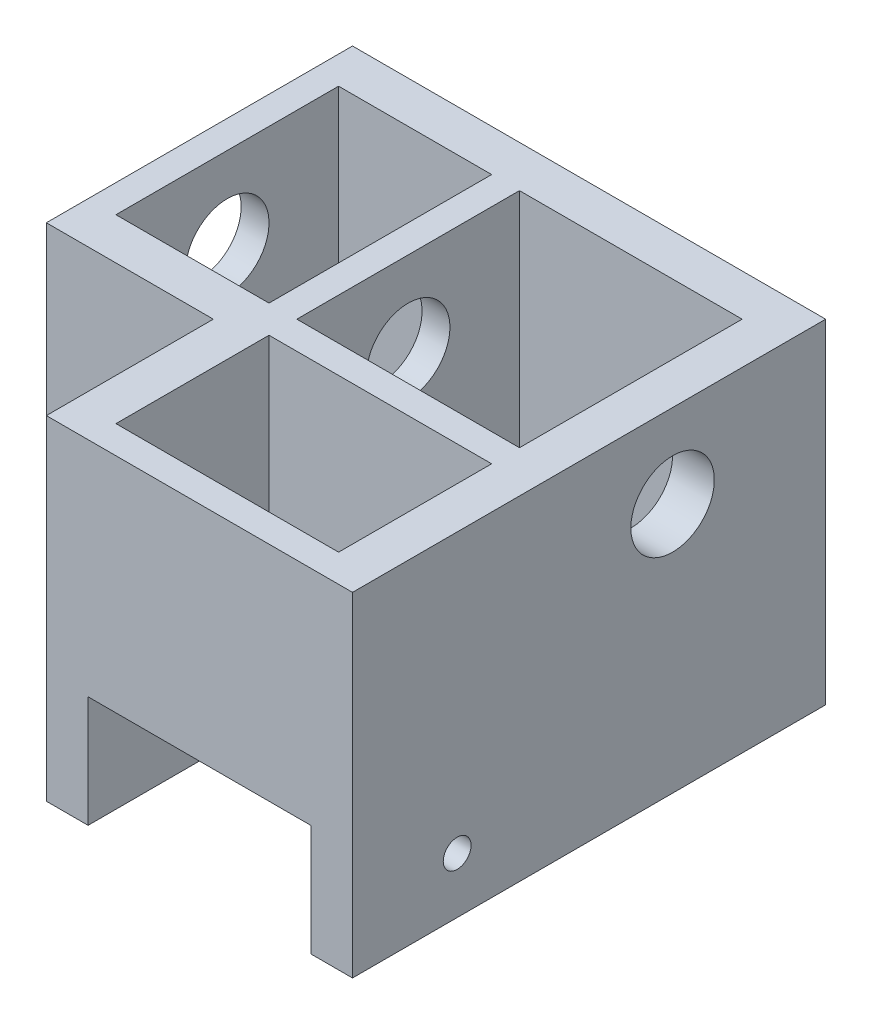
ISO-10303-21;
HEADER;
FILE_DESCRIPTION(('STEP AP214'),'2;1');
FILE_NAME('part.step','',(''),(''),'','','');
FILE_SCHEMA(('AUTOMOTIVE_DESIGN { 1 0 10303 214 1 1 1 1 }'));
ENDSEC;
DATA;
#1=APPLICATION_CONTEXT('core data for automotive mechanical design processes');
#2=APPLICATION_PROTOCOL_DEFINITION('international standard','automotive_design',2000,#1);
#3=PRODUCT_CONTEXT('',#1,'mechanical');
#4=PRODUCT('Part','Part','',(#3));
#5=PRODUCT_RELATED_PRODUCT_CATEGORY('part','',(#4));
#6=PRODUCT_DEFINITION_FORMATION('','',#4);
#7=PRODUCT_DEFINITION_CONTEXT('part definition',#1,'design');
#8=PRODUCT_DEFINITION('design','',#6,#7);
#9=PRODUCT_DEFINITION_SHAPE('','',#8);
#10=(LENGTH_UNIT() NAMED_UNIT(*) SI_UNIT(.MILLI.,.METRE.));
#11=(NAMED_UNIT(*) PLANE_ANGLE_UNIT() SI_UNIT($,.RADIAN.));
#12=(NAMED_UNIT(*) SI_UNIT($,.STERADIAN.) SOLID_ANGLE_UNIT());
#13=UNCERTAINTY_MEASURE_WITH_UNIT(LENGTH_MEASURE(1.E-05),#10,'distance_accuracy_value','');
#14=(GEOMETRIC_REPRESENTATION_CONTEXT(3) GLOBAL_UNCERTAINTY_ASSIGNED_CONTEXT((#13)) GLOBAL_UNIT_ASSIGNED_CONTEXT((#10,
#11,#12)) REPRESENTATION_CONTEXT('',''));
#15=CARTESIAN_POINT('',(0.,0.,0.));
#16=DIRECTION('',(0.,0.,1.));
#17=DIRECTION('',(1.,0.,0.));
#18=AXIS2_PLACEMENT_3D('',#15,#16,#17);
#19=CARTESIAN_POINT('',(0.,152.4,0.));
#20=DIRECTION('',(0.,1.,0.));
#21=DIRECTION('',(0.,0.,1.));
#22=AXIS2_PLACEMENT_3D('',#19,#20,#21);
#23=PLANE('',#22);
#24=DIRECTION('',(0.,0.,1.));
#25=VECTOR('',#24,1.);
#26=CARTESIAN_POINT('',(-133.35,152.4,-50.8));
#27=LINE('',#26,#25);
#28=CARTESIAN_POINT('',(-133.35,152.4,-50.8));
#29=VERTEX_POINT('',#28);
#30=CARTESIAN_POINT('',(-133.35,152.4,50.8));
#31=VERTEX_POINT('',#30);
#32=EDGE_CURVE('E299',#29,#31,#27,.T.);
#33=ORIENTED_EDGE('',*,*,#32,.F.);
#34=DIRECTION('',(-1.,0.,0.));
#35=VECTOR('',#34,1.);
#36=CARTESIAN_POINT('',(-133.35,152.4,-50.8));
#37=LINE('',#36,#35);
#38=CARTESIAN_POINT('',(-63.5,152.4,-50.8));
#39=VERTEX_POINT('',#38);
#40=EDGE_CURVE('E307',#39,#29,#37,.T.);
#41=ORIENTED_EDGE('',*,*,#40,.F.);
#42=DIRECTION('',(0.,0.,-1.));
#43=VECTOR('',#42,1.);
#44=CARTESIAN_POINT('',(-63.5,152.4,-50.8));
#45=LINE('',#44,#43);
#46=CARTESIAN_POINT('',(-63.5,152.4,50.8));
#47=VERTEX_POINT('',#46);
#48=EDGE_CURVE('E304',#47,#39,#45,.T.);
#49=ORIENTED_EDGE('',*,*,#48,.F.);
#50=DIRECTION('',(1.,0.,0.));
#51=VECTOR('',#50,1.);
#52=CARTESIAN_POINT('',(-133.35,152.4,50.8));
#53=LINE('',#52,#51);
#54=EDGE_CURVE('E301',#31,#47,#53,.T.);
#55=ORIENTED_EDGE('',*,*,#54,.F.);
#56=EDGE_LOOP('',(#33,#41,#49,#55));
#57=FACE_BOUND('',#56,.T.);
#58=DIRECTION('',(0.,0.,-1.));
#59=VECTOR('',#58,1.);
#60=CARTESIAN_POINT('',(69.85,152.4,0.));
#61=LINE('',#60,#59);
#62=CARTESIAN_POINT('',(69.8500000000001,152.4,146.05));
#63=VERTEX_POINT('',#62);
#64=CARTESIAN_POINT('',(69.85,152.4,-69.85));
#65=VERTEX_POINT('',#64);
#66=EDGE_CURVE('E382',#63,#65,#61,.T.);
#67=ORIENTED_EDGE('',*,*,#66,.T.);
#68=DIRECTION('',(-1.,0.,0.));
#69=VECTOR('',#68,1.);
#70=CARTESIAN_POINT('',(0.,152.4,-69.85));
#71=LINE('',#70,#69);
#72=CARTESIAN_POINT('',(-146.05,152.4,-69.85));
#73=VERTEX_POINT('',#72);
#74=EDGE_CURVE('E385',#65,#73,#71,.T.);
#75=ORIENTED_EDGE('',*,*,#74,.T.);
#76=DIRECTION('',(0.,0.,-1.));
#77=VECTOR('',#76,1.);
#78=CARTESIAN_POINT('',(-146.05,152.4,69.85));
#79=LINE('',#78,#77);
#80=CARTESIAN_POINT('',(-146.05,152.4,69.85));
#81=VERTEX_POINT('',#80);
#82=EDGE_CURVE('E334',#81,#73,#79,.T.);
#83=ORIENTED_EDGE('',*,*,#82,.F.);
#84=DIRECTION('',(1.,0.,0.));
#85=VECTOR('',#84,1.);
#86=CARTESIAN_POINT('',(0.,152.4,69.85));
#87=LINE('',#86,#85);
#88=CARTESIAN_POINT('',(-69.85,152.4,69.85));
#89=VERTEX_POINT('',#88);
#90=EDGE_CURVE('E388',#81,#89,#87,.T.);
#91=ORIENTED_EDGE('',*,*,#90,.T.);
#92=DIRECTION('',(0.,0.,-1.));
#93=VECTOR('',#92,1.);
#94=CARTESIAN_POINT('',(-69.8499999999999,152.4,146.05));
#95=LINE('',#94,#93);
#96=CARTESIAN_POINT('',(-69.8499999999999,152.4,146.05));
#97=VERTEX_POINT('',#96);
#98=EDGE_CURVE('E272',#97,#89,#95,.T.);
#99=ORIENTED_EDGE('',*,*,#98,.F.);
#100=DIRECTION('',(1.,0.,0.));
#101=VECTOR('',#100,1.);
#102=CARTESIAN_POINT('',(-69.8499999999999,152.4,146.05));
#103=LINE('',#102,#101);
#104=EDGE_CURVE('E253',#97,#63,#103,.T.);
#105=ORIENTED_EDGE('',*,*,#104,.T.);
#106=EDGE_LOOP('',(#67,#75,#83,#91,#99,#105));
#107=FACE_BOUND('',#106,.T.);
#108=DIRECTION('',(-1.,0.,0.));
#109=VECTOR('',#108,1.);
#110=CARTESIAN_POINT('',(-50.8,152.4,-50.8));
#111=LINE('',#110,#109);
#112=CARTESIAN_POINT('',(50.8,152.4,-50.8));
#113=VERTEX_POINT('',#112);
#114=CARTESIAN_POINT('',(-50.8,152.4,-50.8));
#115=VERTEX_POINT('',#114);
#116=EDGE_CURVE('E357',#113,#115,#111,.T.);
#117=ORIENTED_EDGE('',*,*,#116,.F.);
#118=DIRECTION('',(0.,0.,-1.));
#119=VECTOR('',#118,1.);
#120=CARTESIAN_POINT('',(50.8,152.4,50.8));
#121=LINE('',#120,#119);
#122=CARTESIAN_POINT('',(50.8,152.4,50.8));
#123=VERTEX_POINT('',#122);
#124=EDGE_CURVE('E355',#123,#113,#121,.T.);
#125=ORIENTED_EDGE('',*,*,#124,.F.);
#126=DIRECTION('',(1.,0.,0.));
#127=VECTOR('',#126,1.);
#128=CARTESIAN_POINT('',(-50.8,152.4,50.8));
#129=LINE('',#128,#127);
#130=CARTESIAN_POINT('',(-50.8,152.4,50.8));
#131=VERTEX_POINT('',#130);
#132=EDGE_CURVE('E363',#131,#123,#129,.T.);
#133=ORIENTED_EDGE('',*,*,#132,.F.);
#134=DIRECTION('',(0.,0.,1.));
#135=VECTOR('',#134,1.);
#136=CARTESIAN_POINT('',(-50.8,152.4,50.8));
#137=LINE('',#136,#135);
#138=EDGE_CURVE('E360',#115,#131,#137,.T.);
#139=ORIENTED_EDGE('',*,*,#138,.F.);
#140=EDGE_LOOP('',(#117,#125,#133,#139));
#141=FACE_BOUND('',#140,.T.);
#142=DIRECTION('',(0.,0.,1.));
#143=VECTOR('',#142,1.);
#144=CARTESIAN_POINT('',(50.8000000000001,152.4,133.35));
#145=LINE('',#144,#143);
#146=CARTESIAN_POINT('',(50.8,152.4,63.5));
#147=VERTEX_POINT('',#146);
#148=CARTESIAN_POINT('',(50.8000000000001,152.4,133.35));
#149=VERTEX_POINT('',#148);
#150=EDGE_CURVE('E227',#147,#149,#145,.T.);
#151=ORIENTED_EDGE('',*,*,#150,.T.);
#152=DIRECTION('',(-1.,0.,0.));
#153=VECTOR('',#152,1.);
#154=CARTESIAN_POINT('',(50.8000000000001,152.4,133.35));
#155=LINE('',#154,#153);
#156=CARTESIAN_POINT('',(-50.7999999999999,152.4,133.35));
#157=VERTEX_POINT('',#156);
#158=EDGE_CURVE('E82',#149,#157,#155,.T.);
#159=ORIENTED_EDGE('',*,*,#158,.T.);
#160=DIRECTION('',(0.,0.,-1.));
#161=VECTOR('',#160,1.);
#162=CARTESIAN_POINT('',(-50.7999999999999,152.4,133.35));
#163=LINE('',#162,#161);
#164=CARTESIAN_POINT('',(-50.8,152.4,63.5));
#165=VERTEX_POINT('',#164);
#166=EDGE_CURVE('E234',#157,#165,#163,.T.);
#167=ORIENTED_EDGE('',*,*,#166,.T.);
#168=DIRECTION('',(1.,0.,0.));
#169=VECTOR('',#168,1.);
#170=CARTESIAN_POINT('',(50.8,152.4,63.5));
#171=LINE('',#170,#169);
#172=EDGE_CURVE('E219',#165,#147,#171,.T.);
#173=ORIENTED_EDGE('',*,*,#172,.T.);
#174=EDGE_LOOP('',(#151,#159,#167,#173));
#175=FACE_BOUND('',#174,.T.);
#176=ADVANCED_FACE('F66',(#57,#107,#141,#175),#23,.T.);
#177=CARTESIAN_POINT('',(0.,50.8,0.));
#178=DIRECTION('',(0.,1.,0.));
#179=DIRECTION('',(0.,0.,1.));
#180=AXIS2_PLACEMENT_3D('',#177,#178,#179);
#181=PLANE('',#180);
#182=DIRECTION('',(-1.,0.,0.));
#183=VECTOR('',#182,1.);
#184=CARTESIAN_POINT('',(0.,50.8,133.35));
#185=LINE('',#184,#183);
#186=CARTESIAN_POINT('',(50.8000000000001,50.8,133.35));
#187=VERTEX_POINT('',#186);
#188=CARTESIAN_POINT('',(-50.7999999999999,50.8,133.35));
#189=VERTEX_POINT('',#188);
#190=EDGE_CURVE('E12',#187,#189,#185,.T.);
#191=ORIENTED_EDGE('',*,*,#190,.F.);
#192=DIRECTION('',(0.,0.,-1.));
#193=VECTOR('',#192,1.);
#194=CARTESIAN_POINT('',(50.8,50.8,50.8));
#195=LINE('',#194,#193);
#196=CARTESIAN_POINT('',(50.8000000000001,50.8,146.05));
#197=VERTEX_POINT('',#196);
#198=EDGE_CURVE('E286',#197,#187,#195,.T.);
#199=ORIENTED_EDGE('',*,*,#198,.F.);
#200=DIRECTION('',(-1.,0.,0.));
#201=VECTOR('',#200,1.);
#202=CARTESIAN_POINT('',(50.8000000000001,50.8,146.05));
#203=LINE('',#202,#201);
#204=CARTESIAN_POINT('',(-50.7999999999999,50.8,146.05));
#205=VERTEX_POINT('',#204);
#206=EDGE_CURVE('E265',#197,#205,#203,.T.);
#207=ORIENTED_EDGE('',*,*,#206,.T.);
#208=DIRECTION('',(0.,0.,1.));
#209=VECTOR('',#208,1.);
#210=CARTESIAN_POINT('',(-50.8,50.8,50.8));
#211=LINE('',#210,#209);
#212=EDGE_CURVE('E282',#189,#205,#211,.T.);
#213=ORIENTED_EDGE('',*,*,#212,.F.);
#214=EDGE_LOOP('',(#191,#199,#207,#213));
#215=FACE_BOUND('',#214,.T.);
#216=ADVANCED_FACE('F478',(#215),#181,.F.);
#217=DIRECTION('',(1.,0.,0.));
#218=VECTOR('',#217,1.);
#219=CARTESIAN_POINT('',(0.,50.8,63.5));
#220=LINE('',#219,#218);
#221=CARTESIAN_POINT('',(-50.8,50.8,63.5));
#222=VERTEX_POINT('',#221);
#223=CARTESIAN_POINT('',(50.8,50.8,63.5));
#224=VERTEX_POINT('',#223);
#225=EDGE_CURVE('E75',#222,#224,#220,.T.);
#226=ORIENTED_EDGE('',*,*,#225,.F.);
#227=CARTESIAN_POINT('',(-50.8,50.8,50.8));
#228=VERTEX_POINT('',#227);
#229=EDGE_CURVE('E278',#228,#222,#211,.T.);
#230=ORIENTED_EDGE('',*,*,#229,.F.);
#231=DIRECTION('',(-1.,0.,0.));
#232=VECTOR('',#231,1.);
#233=CARTESIAN_POINT('',(-50.8,50.8,50.8));
#234=LINE('',#233,#232);
#235=CARTESIAN_POINT('',(50.8,50.8,50.8));
#236=VERTEX_POINT('',#235);
#237=EDGE_CURVE('E283',#236,#228,#234,.T.);
#238=ORIENTED_EDGE('',*,*,#237,.F.);
#239=EDGE_CURVE('E277',#224,#236,#195,.T.);
#240=ORIENTED_EDGE('',*,*,#239,.F.);
#241=EDGE_LOOP('',(#226,#230,#238,#240));
#242=FACE_BOUND('',#241,.T.);
#243=ADVANCED_FACE('F538',(#242),#181,.F.);
#244=CARTESIAN_POINT('',(0.,0.,0.));
#245=DIRECTION('',(0.,1.,0.));
#246=DIRECTION('',(0.,0.,1.));
#247=AXIS2_PLACEMENT_3D('',#244,#245,#246);
#248=PLANE('',#247);
#249=DIRECTION('',(0.,0.,1.));
#250=VECTOR('',#249,1.);
#251=CARTESIAN_POINT('',(-50.8,0.,50.8));
#252=LINE('',#251,#250);
#253=CARTESIAN_POINT('',(-50.8,0.,50.8));
#254=VERTEX_POINT('',#253);
#255=CARTESIAN_POINT('',(-50.7999999999999,0.,146.05));
#256=VERTEX_POINT('',#255);
#257=EDGE_CURVE('E275',#254,#256,#252,.T.);
#258=ORIENTED_EDGE('',*,*,#257,.T.);
#259=DIRECTION('',(-1.,0.,0.));
#260=VECTOR('',#259,1.);
#261=CARTESIAN_POINT('',(-50.7999999999999,0.,146.05));
#262=LINE('',#261,#260);
#263=CARTESIAN_POINT('',(-69.8499999999999,0.,146.05));
#264=VERTEX_POINT('',#263);
#265=EDGE_CURVE('E259',#256,#264,#262,.T.);
#266=ORIENTED_EDGE('',*,*,#265,.T.);
#267=DIRECTION('',(0.,0.,-1.));
#268=VECTOR('',#267,1.);
#269=CARTESIAN_POINT('',(-69.8499999999999,0.,146.05));
#270=LINE('',#269,#268);
#271=CARTESIAN_POINT('',(-69.85,0.,69.85));
#272=VERTEX_POINT('',#271);
#273=EDGE_CURVE('E268',#264,#272,#270,.T.);
#274=ORIENTED_EDGE('',*,*,#273,.T.);
#275=DIRECTION('',(1.,0.,0.));
#276=VECTOR('',#275,1.);
#277=CARTESIAN_POINT('',(0.,0.,69.85));
#278=LINE('',#277,#276);
#279=CARTESIAN_POINT('',(-146.05,0.,69.85));
#280=VERTEX_POINT('',#279);
#281=EDGE_CURVE('E386',#280,#272,#278,.T.);
#282=ORIENTED_EDGE('',*,*,#281,.F.);
#283=DIRECTION('',(0.,0.,1.));
#284=VECTOR('',#283,1.);
#285=CARTESIAN_POINT('',(-146.05,0.,50.8));
#286=LINE('',#285,#284);
#287=CARTESIAN_POINT('',(-146.05,0.,50.8));
#288=VERTEX_POINT('',#287);
#289=EDGE_CURVE('E328',#288,#280,#286,.T.);
#290=ORIENTED_EDGE('',*,*,#289,.F.);
#291=DIRECTION('',(1.,0.,0.));
#292=VECTOR('',#291,1.);
#293=CARTESIAN_POINT('',(-50.8,0.,50.8));
#294=LINE('',#293,#292);
#295=EDGE_CURVE('E358',#288,#254,#294,.T.);
#296=ORIENTED_EDGE('',*,*,#295,.T.);
#297=EDGE_LOOP('',(#258,#266,#274,#282,#290,#296));
#298=FACE_BOUND('',#297,.T.);
#299=ADVANCED_FACE('F469',(#298),#248,.F.);
#300=DIRECTION('',(0.,0.,-1.));
#301=VECTOR('',#300,1.);
#302=CARTESIAN_POINT('',(69.85,0.,0.));
#303=LINE('',#302,#301);
#304=CARTESIAN_POINT('',(69.8500000000001,0.,146.05));
#305=VERTEX_POINT('',#304);
#306=CARTESIAN_POINT('',(69.85,0.,-69.85));
#307=VERTEX_POINT('',#306);
#308=EDGE_CURVE('E381',#305,#307,#303,.T.);
#309=ORIENTED_EDGE('',*,*,#308,.F.);
#310=DIRECTION('',(-1.,0.,0.));
#311=VECTOR('',#310,1.);
#312=CARTESIAN_POINT('',(69.8500000000001,0.,146.05));
#313=LINE('',#312,#311);
#314=CARTESIAN_POINT('',(50.8000000000001,0.,146.05));
#315=VERTEX_POINT('',#314);
#316=EDGE_CURVE('E247',#305,#315,#313,.T.);
#317=ORIENTED_EDGE('',*,*,#316,.T.);
#318=DIRECTION('',(0.,0.,-1.));
#319=VECTOR('',#318,1.);
#320=CARTESIAN_POINT('',(50.8,0.,50.8));
#321=LINE('',#320,#319);
#322=CARTESIAN_POINT('',(50.8,0.,-50.8));
#323=VERTEX_POINT('',#322);
#324=EDGE_CURVE('E351',#315,#323,#321,.T.);
#325=ORIENTED_EDGE('',*,*,#324,.T.);
#326=DIRECTION('',(-1.,0.,0.));
#327=VECTOR('',#326,1.);
#328=CARTESIAN_POINT('',(-50.8,0.,-50.8));
#329=LINE('',#328,#327);
#330=CARTESIAN_POINT('',(-146.05,0.,-50.8));
#331=VERTEX_POINT('',#330);
#332=EDGE_CURVE('E367',#323,#331,#329,.T.);
#333=ORIENTED_EDGE('',*,*,#332,.T.);
#334=DIRECTION('',(0.,0.,1.));
#335=VECTOR('',#334,1.);
#336=CARTESIAN_POINT('',(-146.05,0.,-69.85));
#337=LINE('',#336,#335);
#338=CARTESIAN_POINT('',(-146.05,0.,-69.85));
#339=VERTEX_POINT('',#338);
#340=EDGE_CURVE('E340',#339,#331,#337,.T.);
#341=ORIENTED_EDGE('',*,*,#340,.F.);
#342=DIRECTION('',(-1.,0.,0.));
#343=VECTOR('',#342,1.);
#344=CARTESIAN_POINT('',(0.,0.,-69.85));
#345=LINE('',#344,#343);
#346=EDGE_CURVE('E394',#307,#339,#345,.T.);
#347=ORIENTED_EDGE('',*,*,#346,.F.);
#348=EDGE_LOOP('',(#309,#317,#325,#333,#341,#347));
#349=FACE_BOUND('',#348,.T.);
#350=ADVANCED_FACE('F446',(#349),#248,.F.);
#351=CARTESIAN_POINT('',(0.,152.4,69.85));
#352=DIRECTION('',(0.,0.,-1.));
#353=DIRECTION('',(-1.,0.,0.));
#354=AXIS2_PLACEMENT_3D('',#351,#352,#353);
#355=PLANE('',#354);
#356=CARTESIAN_POINT('',(-98.298,25.4,69.85));
#357=DIRECTION('',(0.,0.,1.));
#358=DIRECTION('',(1.,0.,0.));
#359=AXIS2_PLACEMENT_3D('',#356,#357,#358);
#360=CIRCLE('',#359,6.35);
#361=CARTESIAN_POINT('',(-91.948,25.4,69.85));
#362=VERTEX_POINT('',#361);
#363=EDGE_CURVE('E281',#362,#362,#360,.T.);
#364=ORIENTED_EDGE('',*,*,#363,.F.);
#365=EDGE_LOOP('',(#364));
#366=FACE_BOUND('',#365,.T.);
#367=ORIENTED_EDGE('',*,*,#281,.T.);
#368=DIRECTION('',(0.,1.,0.));
#369=VECTOR('',#368,1.);
#370=CARTESIAN_POINT('',(-69.85,0.,69.85));
#371=LINE('',#370,#369);
#372=EDGE_CURVE('E241',#272,#89,#371,.T.);
#373=ORIENTED_EDGE('',*,*,#372,.T.);
#374=ORIENTED_EDGE('',*,*,#90,.F.);
#375=DIRECTION('',(0.,1.,0.));
#376=VECTOR('',#375,1.);
#377=CARTESIAN_POINT('',(-146.05,0.,69.85));
#378=LINE('',#377,#376);
#379=EDGE_CURVE('E331',#280,#81,#378,.T.);
#380=ORIENTED_EDGE('',*,*,#379,.F.);
#381=EDGE_LOOP('',(#367,#373,#374,#380));
#382=FACE_BOUND('',#381,.T.);
#383=ADVANCED_FACE('F417',(#366,#382),#355,.F.);
#384=CARTESIAN_POINT('',(-50.8,152.4,50.8));
#385=DIRECTION('',(0.,0.,-1.));
#386=DIRECTION('',(-1.,0.,0.));
#387=AXIS2_PLACEMENT_3D('',#384,#385,#386);
#388=PLANE('',#387);
#389=CARTESIAN_POINT('',(-98.298,25.4,50.8));
#390=DIRECTION('',(0.,0.,-1.));
#391=DIRECTION('',(-1.,0.,0.));
#392=AXIS2_PLACEMENT_3D('',#389,#390,#391);
#393=CIRCLE('',#392,6.35);
#394=CARTESIAN_POINT('',(-104.648,25.4,50.8));
#395=VERTEX_POINT('',#394);
#396=EDGE_CURVE('E293',#395,#395,#393,.T.);
#397=ORIENTED_EDGE('',*,*,#396,.F.);
#398=EDGE_LOOP('',(#397));
#399=FACE_BOUND('',#398,.T.);
#400=DIRECTION('',(-1.,0.,0.));
#401=VECTOR('',#400,1.);
#402=CARTESIAN_POINT('',(-50.8,50.8,50.8));
#403=LINE('',#402,#401);
#404=CARTESIAN_POINT('',(-63.5,50.8,50.8));
#405=VERTEX_POINT('',#404);
#406=EDGE_CURVE('E344',#228,#405,#403,.T.);
#407=ORIENTED_EDGE('',*,*,#406,.F.);
#408=DIRECTION('',(0.,-1.,0.));
#409=VECTOR('',#408,1.);
#410=CARTESIAN_POINT('',(-50.8,154.170510785233,50.8));
#411=LINE('',#410,#409);
#412=EDGE_CURVE('E274',#228,#254,#411,.T.);
#413=ORIENTED_EDGE('',*,*,#412,.T.);
#414=ORIENTED_EDGE('',*,*,#295,.F.);
#415=DIRECTION('',(0.,-1.,0.));
#416=VECTOR('',#415,1.);
#417=CARTESIAN_POINT('',(-146.05,50.8,50.8));
#418=LINE('',#417,#416);
#419=CARTESIAN_POINT('',(-146.05,50.8,50.8));
#420=VERTEX_POINT('',#419);
#421=EDGE_CURVE('E325',#420,#288,#418,.T.);
#422=ORIENTED_EDGE('',*,*,#421,.F.);
#423=CARTESIAN_POINT('',(-133.35,50.8,50.8));
#424=VERTEX_POINT('',#423);
#425=EDGE_CURVE('E343',#424,#420,#403,.T.);
#426=ORIENTED_EDGE('',*,*,#425,.F.);
#427=DIRECTION('',(0.,1.,0.));
#428=VECTOR('',#427,1.);
#429=CARTESIAN_POINT('',(-133.35,0.,50.8));
#430=LINE('',#429,#428);
#431=EDGE_CURVE('E310',#424,#31,#430,.T.);
#432=ORIENTED_EDGE('',*,*,#431,.T.);
#433=ORIENTED_EDGE('',*,*,#54,.T.);
#434=DIRECTION('',(0.,1.,0.));
#435=VECTOR('',#434,1.);
#436=CARTESIAN_POINT('',(-63.5,0.,50.8));
#437=LINE('',#436,#435);
#438=EDGE_CURVE('E316',#405,#47,#437,.T.);
#439=ORIENTED_EDGE('',*,*,#438,.F.);
#440=EDGE_LOOP('',(#407,#413,#414,#422,#426,#432,#433,#439));
#441=FACE_BOUND('',#440,.T.);
#442=ADVANCED_FACE('F413',(#399,#441),#388,.T.);
#443=CARTESIAN_POINT('',(0.,50.8,0.));
#444=DIRECTION('',(0.,1.,0.));
#445=DIRECTION('',(0.,0.,1.));
#446=AXIS2_PLACEMENT_3D('',#443,#444,#445);
#447=PLANE('',#446);
#448=DIRECTION('',(1.,0.,0.));
#449=VECTOR('',#448,1.);
#450=CARTESIAN_POINT('',(-50.8,50.8,-50.8));
#451=LINE('',#450,#449);
#452=CARTESIAN_POINT('',(-146.05,50.8,-50.8));
#453=VERTEX_POINT('',#452);
#454=CARTESIAN_POINT('',(-133.35,50.8,-50.8));
#455=VERTEX_POINT('',#454);
#456=EDGE_CURVE('E352',#453,#455,#451,.T.);
#457=ORIENTED_EDGE('',*,*,#456,.T.);
#458=DIRECTION('',(0.,0.,1.));
#459=VECTOR('',#458,1.);
#460=CARTESIAN_POINT('',(-133.35,50.8,0.));
#461=LINE('',#460,#459);
#462=EDGE_CURVE('E403',#455,#424,#461,.T.);
#463=ORIENTED_EDGE('',*,*,#462,.T.);
#464=ORIENTED_EDGE('',*,*,#425,.T.);
#465=DIRECTION('',(0.,0.,1.));
#466=VECTOR('',#465,1.);
#467=CARTESIAN_POINT('',(-146.05,50.8,-50.8));
#468=LINE('',#467,#466);
#469=EDGE_CURVE('E322',#453,#420,#468,.T.);
#470=ORIENTED_EDGE('',*,*,#469,.F.);
#471=EDGE_LOOP('',(#457,#463,#464,#470));
#472=FACE_BOUND('',#471,.T.);
#473=ADVANCED_FACE('F416',(#472),#447,.F.);
#474=CARTESIAN_POINT('',(69.85,152.4,0.));
#475=DIRECTION('',(-1.,0.,0.));
#476=DIRECTION('',(0.,0.,1.));
#477=AXIS2_PLACEMENT_3D('',#474,#475,#476);
#478=PLANE('',#477);
#479=CARTESIAN_POINT('',(69.8500000000001,114.3,0.));
#480=DIRECTION('',(-1.,0.,0.));
#481=DIRECTION('',(0.,0.,1.));
#482=AXIS2_PLACEMENT_3D('',#479,#480,#481);
#483=CIRCLE('',#482,19.05);
#484=CARTESIAN_POINT('',(69.8500000000001,114.3,19.05));
#485=VERTEX_POINT('',#484);
#486=EDGE_CURVE('E505',#485,#485,#483,.T.);
#487=ORIENTED_EDGE('',*,*,#486,.T.);
#488=EDGE_LOOP('',(#487));
#489=FACE_BOUND('',#488,.T.);
#490=CARTESIAN_POINT('',(69.8500000000001,25.4,98.298));
#491=DIRECTION('',(1.,0.,0.));
#492=DIRECTION('',(0.,0.,-1.));
#493=AXIS2_PLACEMENT_3D('',#490,#491,#492);
#494=CIRCLE('',#493,6.35);
#495=CARTESIAN_POINT('',(69.8500000000001,25.4,91.948));
#496=VERTEX_POINT('',#495);
#497=EDGE_CURVE('E487',#496,#496,#494,.T.);
#498=ORIENTED_EDGE('',*,*,#497,.F.);
#499=EDGE_LOOP('',(#498));
#500=FACE_BOUND('',#499,.T.);
#501=ORIENTED_EDGE('',*,*,#308,.T.);
#502=DIRECTION('',(0.,-1.,0.));
#503=VECTOR('',#502,1.);
#504=CARTESIAN_POINT('',(69.85,152.4,-69.85));
#505=LINE('',#504,#503);
#506=EDGE_CURVE('E391',#65,#307,#505,.T.);
#507=ORIENTED_EDGE('',*,*,#506,.F.);
#508=ORIENTED_EDGE('',*,*,#66,.F.);
#509=DIRECTION('',(0.,-1.,0.));
#510=VECTOR('',#509,1.);
#511=CARTESIAN_POINT('',(69.8500000000001,152.4,146.05));
#512=LINE('',#511,#510);
#513=EDGE_CURVE('E250',#63,#305,#512,.T.);
#514=ORIENTED_EDGE('',*,*,#513,.T.);
#515=EDGE_LOOP('',(#501,#507,#508,#514));
#516=FACE_BOUND('',#515,.T.);
#517=ADVANCED_FACE('F68',(#489,#500,#516),#478,.F.);
#518=CARTESIAN_POINT('',(0.,152.4,-69.85));
#519=DIRECTION('',(0.,0.,1.));
#520=DIRECTION('',(1.,0.,0.));
#521=AXIS2_PLACEMENT_3D('',#518,#519,#520);
#522=PLANE('',#521);
#523=CARTESIAN_POINT('',(-98.298,25.4,-69.85));
#524=DIRECTION('',(0.,0.,1.));
#525=DIRECTION('',(1.,0.,0.));
#526=AXIS2_PLACEMENT_3D('',#523,#524,#525);
#527=CIRCLE('',#526,6.35);
#528=CARTESIAN_POINT('',(-91.948,25.4,-69.85));
#529=VERTEX_POINT('',#528);
#530=EDGE_CURVE('E290',#529,#529,#527,.T.);
#531=ORIENTED_EDGE('',*,*,#530,.T.);
#532=EDGE_LOOP('',(#531));
#533=FACE_BOUND('',#532,.T.);
#534=ORIENTED_EDGE('',*,*,#346,.T.);
#535=DIRECTION('',(0.,-1.,0.));
#536=VECTOR('',#535,1.);
#537=CARTESIAN_POINT('',(-146.05,152.4,-69.85));
#538=LINE('',#537,#536);
#539=EDGE_CURVE('E337',#73,#339,#538,.T.);
#540=ORIENTED_EDGE('',*,*,#539,.F.);
#541=ORIENTED_EDGE('',*,*,#74,.F.);
#542=ORIENTED_EDGE('',*,*,#506,.T.);
#543=EDGE_LOOP('',(#534,#540,#541,#542));
#544=FACE_BOUND('',#543,.T.);
#545=ADVANCED_FACE('F452',(#533,#544),#522,.F.);
#546=CARTESIAN_POINT('',(50.8,152.4,50.8));
#547=DIRECTION('',(-1.,0.,0.));
#548=DIRECTION('',(0.,0.,1.));
#549=AXIS2_PLACEMENT_3D('',#546,#547,#548);
#550=PLANE('',#549);
#551=CARTESIAN_POINT('',(50.8,114.3,0.));
#552=DIRECTION('',(-1.,0.,0.));
#553=DIRECTION('',(0.,0.,1.));
#554=AXIS2_PLACEMENT_3D('',#551,#552,#553);
#555=CIRCLE('',#554,19.05);
#556=CARTESIAN_POINT('',(50.8,114.3,19.05));
#557=VERTEX_POINT('',#556);
#558=EDGE_CURVE('E491',#557,#557,#555,.T.);
#559=ORIENTED_EDGE('',*,*,#558,.F.);
#560=EDGE_LOOP('',(#559));
#561=FACE_BOUND('',#560,.T.);
#562=CARTESIAN_POINT('',(50.8,25.4,98.298));
#563=DIRECTION('',(-1.,0.,0.));
#564=DIRECTION('',(0.,0.,1.));
#565=AXIS2_PLACEMENT_3D('',#562,#563,#564);
#566=CIRCLE('',#565,6.35);
#567=CARTESIAN_POINT('',(50.8,25.4,104.648));
#568=VERTEX_POINT('',#567);
#569=EDGE_CURVE('E480',#568,#568,#566,.F.);
#570=ORIENTED_EDGE('',*,*,#569,.T.);
#571=EDGE_LOOP('',(#570));
#572=FACE_BOUND('',#571,.T.);
#573=DIRECTION('',(0.,-1.,0.));
#574=VECTOR('',#573,1.);
#575=CARTESIAN_POINT('',(50.8,152.4,-50.8));
#576=LINE('',#575,#574);
#577=EDGE_CURVE('E379',#113,#323,#576,.T.);
#578=ORIENTED_EDGE('',*,*,#577,.T.);
#579=ORIENTED_EDGE('',*,*,#324,.F.);
#580=DIRECTION('',(0.,1.,0.));
#581=VECTOR('',#580,1.);
#582=CARTESIAN_POINT('',(50.8000000000001,0.,146.05));
#583=LINE('',#582,#581);
#584=EDGE_CURVE('E244',#315,#197,#583,.T.);
#585=ORIENTED_EDGE('',*,*,#584,.T.);
#586=ORIENTED_EDGE('',*,*,#198,.T.);
#587=DIRECTION('',(0.,1.,0.));
#588=VECTOR('',#587,1.);
#589=CARTESIAN_POINT('',(50.8000000000001,0.,133.35));
#590=LINE('',#589,#588);
#591=EDGE_CURVE('E224',#187,#149,#590,.T.);
#592=ORIENTED_EDGE('',*,*,#591,.T.);
#593=ORIENTED_EDGE('',*,*,#150,.F.);
#594=DIRECTION('',(0.,1.,0.));
#595=VECTOR('',#594,1.);
#596=CARTESIAN_POINT('',(50.8,0.,63.5));
#597=LINE('',#596,#595);
#598=EDGE_CURVE('E90',#224,#147,#597,.T.);
#599=ORIENTED_EDGE('',*,*,#598,.F.);
#600=ORIENTED_EDGE('',*,*,#239,.T.);
#601=DIRECTION('',(0.,-1.,0.));
#602=VECTOR('',#601,1.);
#603=CARTESIAN_POINT('',(50.8,152.4,50.8));
#604=LINE('',#603,#602);
#605=EDGE_CURVE('E365',#123,#236,#604,.T.);
#606=ORIENTED_EDGE('',*,*,#605,.F.);
#607=ORIENTED_EDGE('',*,*,#124,.T.);
#608=EDGE_LOOP('',(#578,#579,#585,#586,#592,#593,#599,#600,#606,#607));
#609=FACE_BOUND('',#608,.T.);
#610=ADVANCED_FACE('F229',(#561,#572,#609),#550,.T.);
#611=CARTESIAN_POINT('',(-50.8,152.4,-50.8));
#612=DIRECTION('',(0.,0.,1.));
#613=DIRECTION('',(1.,0.,0.));
#614=AXIS2_PLACEMENT_3D('',#611,#612,#613);
#615=PLANE('',#614);
#616=CARTESIAN_POINT('',(-98.298,25.4,-50.8));
#617=DIRECTION('',(0.,0.,1.));
#618=DIRECTION('',(1.,0.,0.));
#619=AXIS2_PLACEMENT_3D('',#616,#617,#618);
#620=CIRCLE('',#619,6.35);
#621=CARTESIAN_POINT('',(-91.948,25.4,-50.8));
#622=VERTEX_POINT('',#621);
#623=EDGE_CURVE('E296',#622,#622,#620,.T.);
#624=ORIENTED_EDGE('',*,*,#623,.F.);
#625=EDGE_LOOP('',(#624));
#626=FACE_BOUND('',#625,.T.);
#627=CARTESIAN_POINT('',(-63.5,50.8,-50.8));
#628=VERTEX_POINT('',#627);
#629=CARTESIAN_POINT('',(-50.8,50.8,-50.8));
#630=VERTEX_POINT('',#629);
#631=EDGE_CURVE('E347',#628,#630,#451,.T.);
#632=ORIENTED_EDGE('',*,*,#631,.F.);
#633=DIRECTION('',(0.,1.,0.));
#634=VECTOR('',#633,1.);
#635=CARTESIAN_POINT('',(-63.5,0.,-50.8));
#636=LINE('',#635,#634);
#637=EDGE_CURVE('E314',#628,#39,#636,.T.);
#638=ORIENTED_EDGE('',*,*,#637,.T.);
#639=ORIENTED_EDGE('',*,*,#40,.T.);
#640=DIRECTION('',(0.,1.,0.));
#641=VECTOR('',#640,1.);
#642=CARTESIAN_POINT('',(-133.35,0.,-50.8));
#643=LINE('',#642,#641);
#644=EDGE_CURVE('E311',#455,#29,#643,.T.);
#645=ORIENTED_EDGE('',*,*,#644,.F.);
#646=ORIENTED_EDGE('',*,*,#456,.F.);
#647=DIRECTION('',(0.,1.,0.));
#648=VECTOR('',#647,1.);
#649=CARTESIAN_POINT('',(-146.05,0.,-50.8));
#650=LINE('',#649,#648);
#651=EDGE_CURVE('E313',#331,#453,#650,.T.);
#652=ORIENTED_EDGE('',*,*,#651,.F.);
#653=ORIENTED_EDGE('',*,*,#332,.F.);
#654=ORIENTED_EDGE('',*,*,#577,.F.);
#655=ORIENTED_EDGE('',*,*,#116,.T.);
#656=DIRECTION('',(0.,-1.,0.));
#657=VECTOR('',#656,1.);
#658=CARTESIAN_POINT('',(-50.8,152.4,-50.8));
#659=LINE('',#658,#657);
#660=EDGE_CURVE('E376',#115,#630,#659,.T.);
#661=ORIENTED_EDGE('',*,*,#660,.T.);
#662=EDGE_LOOP('',(#632,#638,#639,#645,#646,#652,#653,#654,#655,#661));
#663=FACE_BOUND('',#662,.T.);
#664=ADVANCED_FACE('F437',(#626,#663),#615,.T.);
#665=CARTESIAN_POINT('',(-50.8,152.4,50.8));
#666=DIRECTION('',(1.,0.,0.));
#667=DIRECTION('',(0.,0.,-1.));
#668=AXIS2_PLACEMENT_3D('',#665,#666,#667);
#669=PLANE('',#668);
#670=CARTESIAN_POINT('',(-50.8,114.3,0.));
#671=DIRECTION('',(1.,0.,0.));
#672=DIRECTION('',(0.,0.,-1.));
#673=AXIS2_PLACEMENT_3D('',#670,#671,#672);
#674=CIRCLE('',#673,19.05);
#675=CARTESIAN_POINT('',(-50.8,114.3,19.05));
#676=VERTEX_POINT('',#675);
#677=EDGE_CURVE('E496',#676,#676,#674,.T.);
#678=ORIENTED_EDGE('',*,*,#677,.F.);
#679=EDGE_LOOP('',(#678));
#680=FACE_BOUND('',#679,.T.);
#681=DIRECTION('',(0.,0.,1.));
#682=VECTOR('',#681,1.);
#683=CARTESIAN_POINT('',(-50.8,50.8,50.8));
#684=LINE('',#683,#682);
#685=EDGE_CURVE('E348',#630,#228,#684,.T.);
#686=ORIENTED_EDGE('',*,*,#685,.F.);
#687=ORIENTED_EDGE('',*,*,#660,.F.);
#688=ORIENTED_EDGE('',*,*,#138,.T.);
#689=DIRECTION('',(0.,-1.,0.));
#690=VECTOR('',#689,1.);
#691=CARTESIAN_POINT('',(-50.8,152.4,50.8));
#692=LINE('',#691,#690);
#693=EDGE_CURVE('E373',#131,#228,#692,.T.);
#694=ORIENTED_EDGE('',*,*,#693,.T.);
#695=EDGE_LOOP('',(#686,#687,#688,#694));
#696=FACE_BOUND('',#695,.T.);
#697=ADVANCED_FACE('F425',(#680,#696),#669,.T.);
#698=ORIENTED_EDGE('',*,*,#237,.T.);
#699=ORIENTED_EDGE('',*,*,#693,.F.);
#700=ORIENTED_EDGE('',*,*,#132,.T.);
#701=ORIENTED_EDGE('',*,*,#605,.T.);
#702=EDGE_LOOP('',(#698,#699,#700,#701));
#703=FACE_BOUND('',#702,.T.);
#704=ADVANCED_FACE('F419',(#703),#388,.T.);
#705=ORIENTED_EDGE('',*,*,#406,.T.);
#706=DIRECTION('',(0.,0.,-1.));
#707=VECTOR('',#706,1.);
#708=CARTESIAN_POINT('',(-63.5,50.8,0.));
#709=LINE('',#708,#707);
#710=EDGE_CURVE('E400',#405,#628,#709,.T.);
#711=ORIENTED_EDGE('',*,*,#710,.T.);
#712=ORIENTED_EDGE('',*,*,#631,.T.);
#713=ORIENTED_EDGE('',*,*,#685,.T.);
#714=EDGE_LOOP('',(#705,#711,#712,#713));
#715=FACE_BOUND('',#714,.T.);
#716=ADVANCED_FACE('F434',(#715),#447,.F.);
#717=CARTESIAN_POINT('',(-146.05,0.,0.));
#718=DIRECTION('',(1.,0.,0.));
#719=DIRECTION('',(0.,0.,-1.));
#720=AXIS2_PLACEMENT_3D('',#717,#718,#719);
#721=PLANE('',#720);
#722=CARTESIAN_POINT('',(-146.05,114.3,0.));
#723=DIRECTION('',(-1.,0.,0.));
#724=DIRECTION('',(0.,0.,1.));
#725=AXIS2_PLACEMENT_3D('',#722,#723,#724);
#726=CIRCLE('',#725,19.05);
#727=CARTESIAN_POINT('',(-146.05,114.3,19.05));
#728=VERTEX_POINT('',#727);
#729=EDGE_CURVE('E502',#728,#728,#726,.T.);
#730=ORIENTED_EDGE('',*,*,#729,.F.);
#731=EDGE_LOOP('',(#730));
#732=FACE_BOUND('',#731,.T.);
#733=ORIENTED_EDGE('',*,*,#651,.T.);
#734=ORIENTED_EDGE('',*,*,#469,.T.);
#735=ORIENTED_EDGE('',*,*,#421,.T.);
#736=ORIENTED_EDGE('',*,*,#289,.T.);
#737=ORIENTED_EDGE('',*,*,#379,.T.);
#738=ORIENTED_EDGE('',*,*,#82,.T.);
#739=ORIENTED_EDGE('',*,*,#539,.T.);
#740=ORIENTED_EDGE('',*,*,#340,.T.);
#741=EDGE_LOOP('',(#733,#734,#735,#736,#737,#738,#739,#740));
#742=FACE_BOUND('',#741,.T.);
#743=ADVANCED_FACE('F448',(#732,#742),#721,.F.);
#744=CARTESIAN_POINT('',(-133.35,0.,-50.8));
#745=DIRECTION('',(-1.,0.,0.));
#746=DIRECTION('',(0.,0.,1.));
#747=AXIS2_PLACEMENT_3D('',#744,#745,#746);
#748=PLANE('',#747);
#749=CARTESIAN_POINT('',(-133.35,114.3,0.));
#750=DIRECTION('',(-1.,0.,0.));
#751=DIRECTION('',(0.,0.,1.));
#752=AXIS2_PLACEMENT_3D('',#749,#750,#751);
#753=CIRCLE('',#752,19.05);
#754=CARTESIAN_POINT('',(-133.35,114.3,19.05));
#755=VERTEX_POINT('',#754);
#756=EDGE_CURVE('E499',#755,#755,#753,.T.);
#757=ORIENTED_EDGE('',*,*,#756,.T.);
#758=EDGE_LOOP('',(#757));
#759=FACE_BOUND('',#758,.T.);
#760=ORIENTED_EDGE('',*,*,#644,.T.);
#761=ORIENTED_EDGE('',*,*,#32,.T.);
#762=ORIENTED_EDGE('',*,*,#431,.F.);
#763=ORIENTED_EDGE('',*,*,#462,.F.);
#764=EDGE_LOOP('',(#760,#761,#762,#763));
#765=FACE_BOUND('',#764,.T.);
#766=ADVANCED_FACE('F572',(#759,#765),#748,.F.);
#767=CARTESIAN_POINT('',(-63.5,0.,-50.8));
#768=DIRECTION('',(1.,0.,0.));
#769=DIRECTION('',(0.,0.,-1.));
#770=AXIS2_PLACEMENT_3D('',#767,#768,#769);
#771=PLANE('',#770);
#772=CARTESIAN_POINT('',(-63.5,114.3,0.));
#773=DIRECTION('',(1.,0.,0.));
#774=DIRECTION('',(0.,0.,-1.));
#775=AXIS2_PLACEMENT_3D('',#772,#773,#774);
#776=CIRCLE('',#775,19.05);
#777=CARTESIAN_POINT('',(-63.5,114.3,19.05));
#778=VERTEX_POINT('',#777);
#779=EDGE_CURVE('E70',#778,#778,#776,.T.);
#780=ORIENTED_EDGE('',*,*,#779,.T.);
#781=EDGE_LOOP('',(#780));
#782=FACE_BOUND('',#781,.T.);
#783=ORIENTED_EDGE('',*,*,#438,.T.);
#784=ORIENTED_EDGE('',*,*,#48,.T.);
#785=ORIENTED_EDGE('',*,*,#637,.F.);
#786=ORIENTED_EDGE('',*,*,#710,.F.);
#787=EDGE_LOOP('',(#783,#784,#785,#786));
#788=FACE_BOUND('',#787,.T.);
#789=ADVANCED_FACE('F512',(#782,#788),#771,.F.);
#790=CARTESIAN_POINT('',(-98.298,25.4,-69.85));
#791=DIRECTION('',(0.,0.,1.));
#792=DIRECTION('',(1.,0.,0.));
#793=AXIS2_PLACEMENT_3D('',#790,#791,#792);
#794=CYLINDRICAL_SURFACE('',#793,6.35);
#795=ORIENTED_EDGE('',*,*,#396,.T.);
#796=EDGE_LOOP('',(#795));
#797=FACE_BOUND('',#796,.T.);
#798=ORIENTED_EDGE('',*,*,#363,.T.);
#799=EDGE_LOOP('',(#798));
#800=FACE_BOUND('',#799,.T.);
#801=ADVANCED_FACE('F410',(#797,#800),#794,.F.);
#802=ORIENTED_EDGE('',*,*,#623,.T.);
#803=EDGE_LOOP('',(#802));
#804=FACE_BOUND('',#803,.T.);
#805=ORIENTED_EDGE('',*,*,#530,.F.);
#806=EDGE_LOOP('',(#805));
#807=FACE_BOUND('',#806,.T.);
#808=ADVANCED_FACE('F559',(#804,#807),#794,.F.);
#809=CARTESIAN_POINT('',(-50.8,154.170510785233,50.8));
#810=DIRECTION('',(1.,0.,0.));
#811=DIRECTION('',(0.,0.,-1.));
#812=AXIS2_PLACEMENT_3D('',#809,#810,#811);
#813=PLANE('',#812);
#814=CARTESIAN_POINT('',(-50.7999999999999,25.4,98.298));
#815=DIRECTION('',(1.,0.,0.));
#816=DIRECTION('',(0.,0.,-1.));
#817=AXIS2_PLACEMENT_3D('',#814,#815,#816);
#818=CIRCLE('',#817,6.35);
#819=CARTESIAN_POINT('',(-50.7999999999999,25.4,91.9480000000001));
#820=VERTEX_POINT('',#819);
#821=EDGE_CURVE('E482',#820,#820,#818,.F.);
#822=ORIENTED_EDGE('',*,*,#821,.T.);
#823=EDGE_LOOP('',(#822));
#824=FACE_BOUND('',#823,.T.);
#825=DIRECTION('',(0.,1.,0.));
#826=VECTOR('',#825,1.);
#827=CARTESIAN_POINT('',(-50.7999999999999,0.,133.35));
#828=LINE('',#827,#826);
#829=EDGE_CURVE('E239',#189,#157,#828,.T.);
#830=ORIENTED_EDGE('',*,*,#829,.F.);
#831=ORIENTED_EDGE('',*,*,#212,.T.);
#832=DIRECTION('',(0.,-1.,0.));
#833=VECTOR('',#832,1.);
#834=CARTESIAN_POINT('',(-50.7999999999999,50.8,146.05));
#835=LINE('',#834,#833);
#836=EDGE_CURVE('E262',#205,#256,#835,.T.);
#837=ORIENTED_EDGE('',*,*,#836,.T.);
#838=ORIENTED_EDGE('',*,*,#257,.F.);
#839=ORIENTED_EDGE('',*,*,#412,.F.);
#840=ORIENTED_EDGE('',*,*,#229,.T.);
#841=DIRECTION('',(0.,1.,0.));
#842=VECTOR('',#841,1.);
#843=CARTESIAN_POINT('',(-50.8,0.,63.5));
#844=LINE('',#843,#842);
#845=EDGE_CURVE('E223',#222,#165,#844,.T.);
#846=ORIENTED_EDGE('',*,*,#845,.T.);
#847=ORIENTED_EDGE('',*,*,#166,.F.);
#848=EDGE_LOOP('',(#830,#831,#837,#838,#839,#840,#846,#847));
#849=FACE_BOUND('',#848,.T.);
#850=ADVANCED_FACE('F474',(#824,#849),#813,.T.);
#851=CARTESIAN_POINT('',(-69.8499999999999,0.,146.05));
#852=DIRECTION('',(-1.,0.,0.));
#853=DIRECTION('',(0.,0.,1.));
#854=AXIS2_PLACEMENT_3D('',#851,#852,#853);
#855=PLANE('',#854);
#856=CARTESIAN_POINT('',(-69.85,25.4,98.298));
#857=DIRECTION('',(1.,0.,0.));
#858=DIRECTION('',(0.,0.,-1.));
#859=AXIS2_PLACEMENT_3D('',#856,#857,#858);
#860=CIRCLE('',#859,6.35);
#861=CARTESIAN_POINT('',(-69.85,25.4,91.9480000000001));
#862=VERTEX_POINT('',#861);
#863=EDGE_CURVE('E488',#862,#862,#860,.T.);
#864=ORIENTED_EDGE('',*,*,#863,.T.);
#865=EDGE_LOOP('',(#864));
#866=FACE_BOUND('',#865,.T.);
#867=ORIENTED_EDGE('',*,*,#372,.F.);
#868=ORIENTED_EDGE('',*,*,#273,.F.);
#869=DIRECTION('',(0.,1.,0.));
#870=VECTOR('',#869,1.);
#871=CARTESIAN_POINT('',(-69.8499999999999,0.,146.05));
#872=LINE('',#871,#870);
#873=EDGE_CURVE('E256',#264,#97,#872,.T.);
#874=ORIENTED_EDGE('',*,*,#873,.T.);
#875=ORIENTED_EDGE('',*,*,#98,.T.);
#876=EDGE_LOOP('',(#867,#868,#874,#875));
#877=FACE_BOUND('',#876,.T.);
#878=ADVANCED_FACE('F467',(#866,#877),#855,.T.);
#879=CARTESIAN_POINT('',(0.,0.,146.05));
#880=DIRECTION('',(0.,0.,-1.));
#881=DIRECTION('',(1.,0.,0.));
#882=AXIS2_PLACEMENT_3D('',#879,#880,#881);
#883=PLANE('',#882);
#884=ORIENTED_EDGE('',*,*,#584,.F.);
#885=ORIENTED_EDGE('',*,*,#316,.F.);
#886=ORIENTED_EDGE('',*,*,#513,.F.);
#887=ORIENTED_EDGE('',*,*,#104,.F.);
#888=ORIENTED_EDGE('',*,*,#873,.F.);
#889=ORIENTED_EDGE('',*,*,#265,.F.);
#890=ORIENTED_EDGE('',*,*,#836,.F.);
#891=ORIENTED_EDGE('',*,*,#206,.F.);
#892=EDGE_LOOP('',(#884,#885,#886,#887,#888,#889,#890,#891));
#893=FACE_BOUND('',#892,.T.);
#894=ADVANCED_FACE('F459',(#893),#883,.F.);
#895=CARTESIAN_POINT('',(50.8000000000001,0.,133.35));
#896=DIRECTION('',(0.,0.,-1.));
#897=DIRECTION('',(-1.,0.,0.));
#898=AXIS2_PLACEMENT_3D('',#895,#896,#897);
#899=PLANE('',#898);
#900=ORIENTED_EDGE('',*,*,#190,.T.);
#901=ORIENTED_EDGE('',*,*,#829,.T.);
#902=ORIENTED_EDGE('',*,*,#158,.F.);
#903=ORIENTED_EDGE('',*,*,#591,.F.);
#904=EDGE_LOOP('',(#900,#901,#902,#903));
#905=FACE_BOUND('',#904,.T.);
#906=ADVANCED_FACE('F479',(#905),#899,.T.);
#907=CARTESIAN_POINT('',(50.8,0.,63.5));
#908=DIRECTION('',(0.,0.,1.));
#909=DIRECTION('',(1.,0.,0.));
#910=AXIS2_PLACEMENT_3D('',#907,#908,#909);
#911=PLANE('',#910);
#912=ORIENTED_EDGE('',*,*,#225,.T.);
#913=ORIENTED_EDGE('',*,*,#598,.T.);
#914=ORIENTED_EDGE('',*,*,#172,.F.);
#915=ORIENTED_EDGE('',*,*,#845,.F.);
#916=EDGE_LOOP('',(#912,#913,#914,#915));
#917=FACE_BOUND('',#916,.T.);
#918=ADVANCED_FACE('F217',(#917),#911,.T.);
#919=CARTESIAN_POINT('',(69.8500000000001,25.4,98.298));
#920=DIRECTION('',(-1.,0.,0.));
#921=DIRECTION('',(0.,0.,1.));
#922=AXIS2_PLACEMENT_3D('',#919,#920,#921);
#923=CYLINDRICAL_SURFACE('',#922,6.35);
#924=ORIENTED_EDGE('',*,*,#821,.F.);
#925=EDGE_LOOP('',(#924));
#926=FACE_BOUND('',#925,.T.);
#927=ORIENTED_EDGE('',*,*,#863,.F.);
#928=EDGE_LOOP('',(#927));
#929=FACE_BOUND('',#928,.T.);
#930=ADVANCED_FACE('F527',(#926,#929),#923,.F.);
#931=ORIENTED_EDGE('',*,*,#569,.F.);
#932=EDGE_LOOP('',(#931));
#933=FACE_BOUND('',#932,.T.);
#934=ORIENTED_EDGE('',*,*,#497,.T.);
#935=EDGE_LOOP('',(#934));
#936=FACE_BOUND('',#935,.T.);
#937=ADVANCED_FACE('F518',(#933,#936),#923,.F.);
#938=CARTESIAN_POINT('',(69.8500000000001,114.3,0.));
#939=DIRECTION('',(-1.,0.,0.));
#940=DIRECTION('',(0.,0.,1.));
#941=AXIS2_PLACEMENT_3D('',#938,#939,#940);
#942=CYLINDRICAL_SURFACE('',#941,19.05);
#943=CARTESIAN_POINT('',(-50.8,114.3,19.05));
#944=CARTESIAN_POINT('',(-50.9322916666667,114.3,19.05));
#945=CARTESIAN_POINT('',(-51.0645833333333,114.3,19.05));
#946=CARTESIAN_POINT('',(-51.3291666666667,114.3,19.05));
#947=CARTESIAN_POINT('',(-51.4614583333333,114.3,19.05));
#948=CARTESIAN_POINT('',(-51.7260416666666,114.3,19.05));
#949=CARTESIAN_POINT('',(-51.8583333333333,114.3,19.05));
#950=CARTESIAN_POINT('',(-52.1229166666666,114.3,19.05));
#951=CARTESIAN_POINT('',(-52.2552083333333,114.3,19.05));
#952=CARTESIAN_POINT('',(-52.5197916666667,114.3,19.05));
#953=CARTESIAN_POINT('',(-52.6520833333333,114.3,19.05));
#954=CARTESIAN_POINT('',(-52.9166666666667,114.3,19.05));
#955=CARTESIAN_POINT('',(-53.0489583333333,114.3,19.05));
#956=CARTESIAN_POINT('',(-53.3135416666667,114.3,19.05));
#957=CARTESIAN_POINT('',(-53.4458333333333,114.3,19.05));
#958=CARTESIAN_POINT('',(-53.7104166666667,114.3,19.05));
#959=CARTESIAN_POINT('',(-53.8427083333333,114.3,19.05));
#960=CARTESIAN_POINT('',(-54.1072916666667,114.3,19.05));
#961=CARTESIAN_POINT('',(-54.2395833333333,114.3,19.05));
#962=CARTESIAN_POINT('',(-54.5041666666666,114.3,19.05));
#963=CARTESIAN_POINT('',(-54.6364583333333,114.3,19.05));
#964=CARTESIAN_POINT('',(-54.9010416666667,114.3,19.05));
#965=CARTESIAN_POINT('',(-55.0333333333333,114.3,19.05));
#966=CARTESIAN_POINT('',(-55.2979166666667,114.3,19.05));
#967=CARTESIAN_POINT('',(-55.4302083333333,114.3,19.05));
#968=CARTESIAN_POINT('',(-55.6947916666667,114.3,19.05));
#969=CARTESIAN_POINT('',(-55.8270833333333,114.3,19.05));
#970=CARTESIAN_POINT('',(-56.0916666666667,114.3,19.05));
#971=CARTESIAN_POINT('',(-56.2239583333333,114.3,19.05));
#972=CARTESIAN_POINT('',(-56.4885416666667,114.3,19.05));
#973=CARTESIAN_POINT('',(-56.6208333333333,114.3,19.05));
#974=CARTESIAN_POINT('',(-56.8854166666667,114.3,19.05));
#975=CARTESIAN_POINT('',(-57.0177083333333,114.3,19.05));
#976=CARTESIAN_POINT('',(-57.2822916666667,114.3,19.05));
#977=CARTESIAN_POINT('',(-57.4145833333333,114.3,19.05));
#978=CARTESIAN_POINT('',(-57.6791666666667,114.3,19.05));
#979=CARTESIAN_POINT('',(-57.8114583333333,114.3,19.05));
#980=CARTESIAN_POINT('',(-58.0760416666667,114.3,19.05));
#981=CARTESIAN_POINT('',(-58.2083333333333,114.3,19.05));
#982=CARTESIAN_POINT('',(-58.4729166666667,114.3,19.05));
#983=CARTESIAN_POINT('',(-58.6052083333333,114.3,19.05));
#984=CARTESIAN_POINT('',(-58.8697916666667,114.3,19.05));
#985=CARTESIAN_POINT('',(-59.0020833333333,114.3,19.05));
#986=CARTESIAN_POINT('',(-59.2666666666667,114.3,19.05));
#987=CARTESIAN_POINT('',(-59.3989583333333,114.3,19.05));
#988=CARTESIAN_POINT('',(-59.6635416666667,114.3,19.05));
#989=CARTESIAN_POINT('',(-59.7958333333333,114.3,19.05));
#990=CARTESIAN_POINT('',(-60.0604166666667,114.3,19.05));
#991=CARTESIAN_POINT('',(-60.1927083333333,114.3,19.05));
#992=CARTESIAN_POINT('',(-60.4572916666667,114.3,19.05));
#993=CARTESIAN_POINT('',(-60.5895833333333,114.3,19.05));
#994=CARTESIAN_POINT('',(-60.8541666666667,114.3,19.05));
#995=CARTESIAN_POINT('',(-60.9864583333333,114.3,19.05));
#996=CARTESIAN_POINT('',(-61.2510416666667,114.3,19.05));
#997=CARTESIAN_POINT('',(-61.3833333333333,114.3,19.05));
#998=CARTESIAN_POINT('',(-61.6479166666667,114.3,19.05));
#999=CARTESIAN_POINT('',(-61.7802083333333,114.3,19.05));
#1000=CARTESIAN_POINT('',(-62.0447916666667,114.3,19.05));
#1001=CARTESIAN_POINT('',(-62.1770833333333,114.3,19.05));
#1002=CARTESIAN_POINT('',(-62.4416666666667,114.3,19.05));
#1003=CARTESIAN_POINT('',(-62.5739583333333,114.3,19.05));
#1004=CARTESIAN_POINT('',(-62.8385416666667,114.3,19.05));
#1005=CARTESIAN_POINT('',(-62.9708333333333,114.3,19.05));
#1006=CARTESIAN_POINT('',(-63.2354166666667,114.3,19.05));
#1007=CARTESIAN_POINT('',(-63.3677083333333,114.3,19.05));
#1008=CARTESIAN_POINT('',(-63.5,114.3,19.05));
#1009=B_SPLINE_CURVE_WITH_KNOTS('',3,(#943,#944,#945,#946,#947,#948,#949,#950,#951,#952,#953,
#954,#955,#956,#957,#958,#959,#960,#961,#962,#963,#964,#965,#966,#967,#968,#969,#970,#971,#972,
#973,#974,#975,#976,#977,#978,#979,#980,#981,#982,#983,#984,#985,#986,#987,#988,#989,#990,#991,
#992,#993,#994,#995,#996,#997,#998,#999,#1000,#1001,#1002,#1003,#1004,#1005,#1006,#1007,#1008),
.UNSPECIFIED.,.F.,.F.,(4,2,2,2,2,2,2,2,2,2,2,2,2,2,2,2,2,2,2,2,2,2,2,2,2,2,2,2,2,2,2,2,4),(0.,
0.396875000000005,0.793749999999996,1.190625,1.58750000000001,1.984375,2.38125,2.77812500000001,
3.17500000000001,3.571875,3.96875000000001,4.36562500000001,4.7625,5.15937499999999,
5.55625000000001,5.953125,6.34999999999999,6.74687500000001,7.14375,7.54062500000002,
7.93750000000001,8.334375,8.73125000000002,9.12812500000001,9.52500000000001,9.92187500000002,
10.31875,10.715625,11.1125,11.509375,11.90625,12.303125,12.7),.UNSPECIFIED.);
#1010=EDGE_CURVE('BSEAM515',#676,#778,#1009,.T.);
#1011=ORIENTED_EDGE('',*,*,#677,.T.);
#1012=ORIENTED_EDGE('',*,*,#779,.F.);
#1013=ORIENTED_EDGE('',*,*,#1010,.T.);
#1014=ORIENTED_EDGE('',*,*,#1010,.F.);
#1015=EDGE_LOOP('',(#1011,#1013,#1012,#1014));
#1016=FACE_BOUND('',#1015,.T.);
#1017=ADVANCED_FACE('F515',(#1016),#942,.F.);
#1018=ORIENTED_EDGE('',*,*,#729,.T.);
#1019=EDGE_LOOP('',(#1018));
#1020=FACE_BOUND('',#1019,.T.);
#1021=ORIENTED_EDGE('',*,*,#756,.F.);
#1022=EDGE_LOOP('',(#1021));
#1023=FACE_BOUND('',#1022,.T.);
#1024=ADVANCED_FACE('F517',(#1020,#1023),#942,.F.);
#1025=ORIENTED_EDGE('',*,*,#558,.T.);
#1026=EDGE_LOOP('',(#1025));
#1027=FACE_BOUND('',#1026,.T.);
#1028=ORIENTED_EDGE('',*,*,#486,.F.);
#1029=EDGE_LOOP('',(#1028));
#1030=FACE_BOUND('',#1029,.T.);
#1031=ADVANCED_FACE('F521',(#1027,#1030),#942,.F.);
#1032=CLOSED_SHELL('',(#176,#216,#243,#299,#350,#383,#442,#473,#517,#545,#610,#664,#697,#704,
#716,#743,#766,#789,#801,#808,#850,#878,#894,#906,#918,#930,#937,#1017,#1024,#1031));
#1033=MANIFOLD_SOLID_BREP('B2',#1032);
#1034=ADVANCED_BREP_SHAPE_REPRESENTATION('',(#18,#1033),#14);
#1035=SHAPE_DEFINITION_REPRESENTATION(#9,#1034);
ENDSEC;
END-ISO-10303-21;
